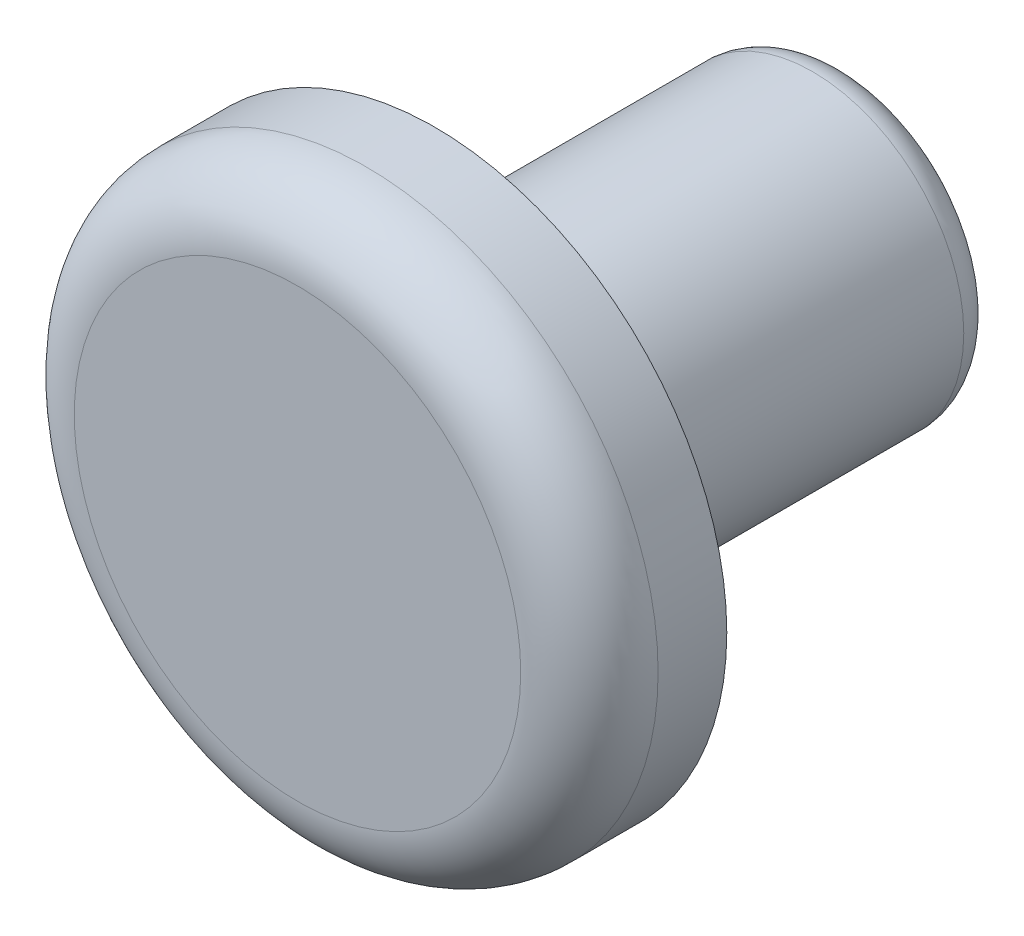
ISO-10303-21;
HEADER;
FILE_DESCRIPTION(('STEP AP214'),'2;1');
FILE_NAME('part.step','',(''),(''),'','','');
FILE_SCHEMA(('AUTOMOTIVE_DESIGN { 1 0 10303 214 1 1 1 1 }'));
ENDSEC;
DATA;
#1=APPLICATION_CONTEXT('core data for automotive mechanical design processes');
#2=APPLICATION_PROTOCOL_DEFINITION('international standard','automotive_design',2000,#1);
#3=PRODUCT_CONTEXT('',#1,'mechanical');
#4=PRODUCT('Part','Part','',(#3));
#5=PRODUCT_RELATED_PRODUCT_CATEGORY('part','',(#4));
#6=PRODUCT_DEFINITION_FORMATION('','',#4);
#7=PRODUCT_DEFINITION_CONTEXT('part definition',#1,'design');
#8=PRODUCT_DEFINITION('design','',#6,#7);
#9=PRODUCT_DEFINITION_SHAPE('','',#8);
#10=(LENGTH_UNIT() NAMED_UNIT(*) SI_UNIT(.MILLI.,.METRE.));
#11=(NAMED_UNIT(*) PLANE_ANGLE_UNIT() SI_UNIT($,.RADIAN.));
#12=(NAMED_UNIT(*) SI_UNIT($,.STERADIAN.) SOLID_ANGLE_UNIT());
#13=UNCERTAINTY_MEASURE_WITH_UNIT(LENGTH_MEASURE(1.E-05),#10,'distance_accuracy_value','');
#14=(GEOMETRIC_REPRESENTATION_CONTEXT(3) GLOBAL_UNCERTAINTY_ASSIGNED_CONTEXT((#13)) GLOBAL_UNIT_ASSIGNED_CONTEXT((#10,
#11,#12)) REPRESENTATION_CONTEXT('',''));
#15=CARTESIAN_POINT('',(0.,0.,0.));
#16=DIRECTION('',(0.,0.,1.));
#17=DIRECTION('',(1.,0.,0.));
#18=AXIS2_PLACEMENT_3D('',#15,#16,#17);
#19=CARTESIAN_POINT('',(0.,0.,1.));
#20=DIRECTION('',(0.,0.,-1.));
#21=DIRECTION('',(-1.,0.,0.));
#22=AXIS2_PLACEMENT_3D('',#19,#20,#21);
#23=CYLINDRICAL_SURFACE('',#22,2.125);
#24=CARTESIAN_POINT('',(0.,0.,0.5));
#25=DIRECTION('',(0.,0.,1.));
#26=DIRECTION('',(1.,0.,0.));
#27=AXIS2_PLACEMENT_3D('',#24,#25,#26);
#28=CIRCLE('',#27,2.125);
#29=CARTESIAN_POINT('',(2.125,0.,0.5));
#30=VERTEX_POINT('',#29);
#31=EDGE_CURVE('E42',#30,#30,#28,.F.);
#32=ORIENTED_EDGE('',*,*,#31,.T.);
#33=EDGE_LOOP('',(#32));
#34=FACE_BOUND('',#33,.T.);
#35=CARTESIAN_POINT('',(0.,0.,0.));
#36=DIRECTION('',(0.,0.,1.));
#37=DIRECTION('',(1.,0.,0.));
#38=AXIS2_PLACEMENT_3D('',#35,#36,#37);
#39=CIRCLE('',#38,2.125);
#40=CARTESIAN_POINT('',(2.125,0.,0.));
#41=VERTEX_POINT('',#40);
#42=EDGE_CURVE('E52',#41,#41,#39,.T.);
#43=ORIENTED_EDGE('',*,*,#42,.T.);
#44=EDGE_LOOP('',(#43));
#45=FACE_BOUND('',#44,.T.);
#46=ADVANCED_FACE('F31',(#34,#45),#23,.T.);
#47=CARTESIAN_POINT('',(0.,0.,1.));
#48=DIRECTION('',(0.,0.,1.));
#49=DIRECTION('',(1.,0.,0.));
#50=AXIS2_PLACEMENT_3D('',#47,#48,#49);
#51=PLANE('',#50);
#52=CARTESIAN_POINT('',(0.,0.,1.));
#53=DIRECTION('',(0.,0.,1.));
#54=DIRECTION('',(1.,0.,0.));
#55=AXIS2_PLACEMENT_3D('',#52,#53,#54);
#56=CIRCLE('',#55,1.625);
#57=CARTESIAN_POINT('',(1.625,0.,1.));
#58=VERTEX_POINT('',#57);
#59=EDGE_CURVE('E46',#58,#58,#56,.T.);
#60=ORIENTED_EDGE('',*,*,#59,.T.);
#61=EDGE_LOOP('',(#60));
#62=FACE_BOUND('',#61,.T.);
#63=ADVANCED_FACE('F63',(#62),#51,.T.);
#64=CARTESIAN_POINT('',(0.,0.,0.));
#65=DIRECTION('',(0.,0.,1.));
#66=DIRECTION('',(1.,0.,0.));
#67=AXIS2_PLACEMENT_3D('',#64,#65,#66);
#68=PLANE('',#67);
#69=CARTESIAN_POINT('',(0.,0.,0.));
#70=DIRECTION('',(0.,0.,-1.));
#71=DIRECTION('',(-1.,0.,0.));
#72=AXIS2_PLACEMENT_3D('',#69,#70,#71);
#73=CIRCLE('',#72,1.1);
#74=CARTESIAN_POINT('',(-1.1,0.,0.));
#75=VERTEX_POINT('',#74);
#76=EDGE_CURVE('E51',#75,#75,#73,.T.);
#77=ORIENTED_EDGE('',*,*,#76,.F.);
#78=EDGE_LOOP('',(#77));
#79=FACE_BOUND('',#78,.T.);
#80=ORIENTED_EDGE('',*,*,#42,.F.);
#81=EDGE_LOOP('',(#80));
#82=FACE_BOUND('',#81,.T.);
#83=ADVANCED_FACE('F60',(#79,#82),#68,.F.);
#84=CARTESIAN_POINT('',(0.,0.,-3.));
#85=DIRECTION('',(0.,0.,1.));
#86=DIRECTION('',(1.,0.,0.));
#87=AXIS2_PLACEMENT_3D('',#84,#85,#86);
#88=CYLINDRICAL_SURFACE('',#87,1.1);
#89=CARTESIAN_POINT('',(0.,0.,-2.75));
#90=DIRECTION('',(0.,0.,-1.));
#91=DIRECTION('',(-1.,0.,0.));
#92=AXIS2_PLACEMENT_3D('',#89,#90,#91);
#93=CIRCLE('',#92,1.1);
#94=CARTESIAN_POINT('',(-1.1,0.,-2.75));
#95=VERTEX_POINT('',#94);
#96=EDGE_CURVE('E10',#95,#95,#93,.F.);
#97=ORIENTED_EDGE('',*,*,#96,.T.);
#98=EDGE_LOOP('',(#97));
#99=FACE_BOUND('',#98,.T.);
#100=ORIENTED_EDGE('',*,*,#76,.T.);
#101=EDGE_LOOP('',(#100));
#102=FACE_BOUND('',#101,.T.);
#103=ADVANCED_FACE('F58',(#99,#102),#88,.T.);
#104=CARTESIAN_POINT('',(0.,0.,-3.));
#105=DIRECTION('',(0.,0.,-1.));
#106=DIRECTION('',(-1.,0.,0.));
#107=AXIS2_PLACEMENT_3D('',#104,#105,#106);
#108=PLANE('',#107);
#109=CARTESIAN_POINT('',(0.,0.,-3.));
#110=DIRECTION('',(0.,0.,-1.));
#111=DIRECTION('',(-1.,0.,0.));
#112=AXIS2_PLACEMENT_3D('',#109,#110,#111);
#113=CIRCLE('',#112,0.85);
#114=CARTESIAN_POINT('',(-0.85,0.,-3.));
#115=VERTEX_POINT('',#114);
#116=EDGE_CURVE('E38',#115,#115,#113,.T.);
#117=ORIENTED_EDGE('',*,*,#116,.T.);
#118=EDGE_LOOP('',(#117));
#119=FACE_BOUND('',#118,.T.);
#120=ADVANCED_FACE('F77',(#119),#108,.T.);
#121=CARTESIAN_POINT('',(0.,0.,0.5));
#122=DIRECTION('',(0.,0.,1.));
#123=DIRECTION('',(1.,0.,0.));
#124=AXIS2_PLACEMENT_3D('',#121,#122,#123);
#125=TOROIDAL_SURFACE('',#124,1.625,0.5);
#126=ORIENTED_EDGE('',*,*,#31,.F.);
#127=EDGE_LOOP('',(#126));
#128=FACE_BOUND('',#127,.T.);
#129=ORIENTED_EDGE('',*,*,#59,.F.);
#130=EDGE_LOOP('',(#129));
#131=FACE_BOUND('',#130,.T.);
#132=ADVANCED_FACE('F75',(#128,#131),#125,.T.);
#133=CARTESIAN_POINT('',(0.,0.,-2.75));
#134=DIRECTION('',(0.,0.,-1.));
#135=DIRECTION('',(-1.,0.,0.));
#136=AXIS2_PLACEMENT_3D('',#133,#134,#135);
#137=TOROIDAL_SURFACE('',#136,0.85,0.25);
#138=ORIENTED_EDGE('',*,*,#96,.F.);
#139=EDGE_LOOP('',(#138));
#140=FACE_BOUND('',#139,.T.);
#141=ORIENTED_EDGE('',*,*,#116,.F.);
#142=EDGE_LOOP('',(#141));
#143=FACE_BOUND('',#142,.T.);
#144=ADVANCED_FACE('F33',(#140,#143),#137,.T.);
#145=CLOSED_SHELL('',(#46,#63,#83,#103,#120,#132,#144));
#146=MANIFOLD_SOLID_BREP('B2',#145);
#147=ADVANCED_BREP_SHAPE_REPRESENTATION('',(#18,#146),#14);
#148=SHAPE_DEFINITION_REPRESENTATION(#9,#147);
ENDSEC;
END-ISO-10303-21;
